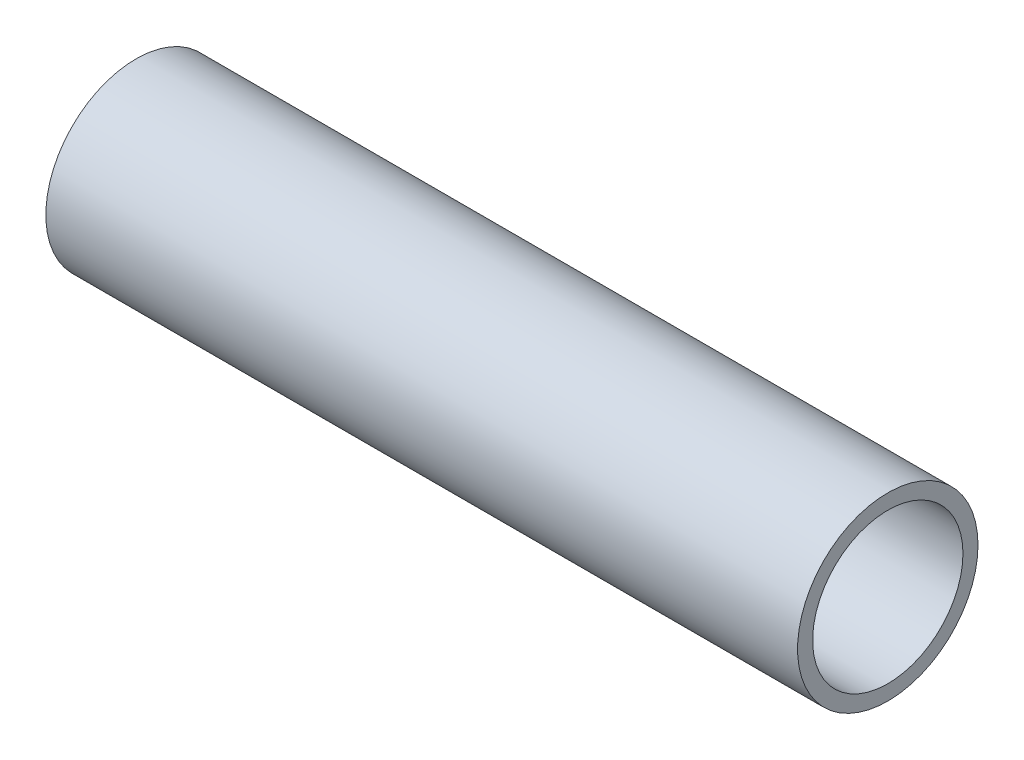
ISO-10303-21;
HEADER;
FILE_DESCRIPTION(('STEP AP214'),'2;1');
FILE_NAME('part.step','',(''),(''),'','','');
FILE_SCHEMA(('AUTOMOTIVE_DESIGN { 1 0 10303 214 1 1 1 1 }'));
ENDSEC;
DATA;
#1=APPLICATION_CONTEXT('core data for automotive mechanical design processes');
#2=APPLICATION_PROTOCOL_DEFINITION('international standard','automotive_design',2000,#1);
#3=PRODUCT_CONTEXT('',#1,'mechanical');
#4=PRODUCT('Part','Part','',(#3));
#5=PRODUCT_RELATED_PRODUCT_CATEGORY('part','',(#4));
#6=PRODUCT_DEFINITION_FORMATION('','',#4);
#7=PRODUCT_DEFINITION_CONTEXT('part definition',#1,'design');
#8=PRODUCT_DEFINITION('design','',#6,#7);
#9=PRODUCT_DEFINITION_SHAPE('','',#8);
#10=(LENGTH_UNIT() NAMED_UNIT(*) SI_UNIT(.MILLI.,.METRE.));
#11=(NAMED_UNIT(*) PLANE_ANGLE_UNIT() SI_UNIT($,.RADIAN.));
#12=(NAMED_UNIT(*) SI_UNIT($,.STERADIAN.) SOLID_ANGLE_UNIT());
#13=UNCERTAINTY_MEASURE_WITH_UNIT(LENGTH_MEASURE(1.E-05),#10,'distance_accuracy_value','');
#14=(GEOMETRIC_REPRESENTATION_CONTEXT(3) GLOBAL_UNCERTAINTY_ASSIGNED_CONTEXT((#13)) GLOBAL_UNIT_ASSIGNED_CONTEXT((#10,
#11,#12)) REPRESENTATION_CONTEXT('',''));
#15=CARTESIAN_POINT('',(0.,0.,0.));
#16=DIRECTION('',(0.,0.,1.));
#17=DIRECTION('',(1.,0.,0.));
#18=AXIS2_PLACEMENT_3D('',#15,#16,#17);
#19=CARTESIAN_POINT('',(25.,0.,0.));
#20=DIRECTION('',(1.,0.,0.));
#21=DIRECTION('',(0.,0.,-1.));
#22=AXIS2_PLACEMENT_3D('',#19,#20,#21);
#23=PLANE('',#22);
#24=CARTESIAN_POINT('',(25.,0.,0.));
#25=DIRECTION('',(1.,0.,0.));
#26=DIRECTION('',(0.,0.,-1.));
#27=AXIS2_PLACEMENT_3D('',#24,#25,#26);
#28=CIRCLE('',#27,6.);
#29=CARTESIAN_POINT('',(25.,0.,-6.));
#30=VERTEX_POINT('',#29);
#31=EDGE_CURVE('E10',#30,#30,#28,.T.);
#32=ORIENTED_EDGE('',*,*,#31,.T.);
#33=EDGE_LOOP('',(#32));
#34=FACE_BOUND('',#33,.T.);
#35=CARTESIAN_POINT('',(25.,0.,0.));
#36=DIRECTION('',(1.,0.,0.));
#37=DIRECTION('',(0.,0.,-1.));
#38=AXIS2_PLACEMENT_3D('',#35,#36,#37);
#39=CIRCLE('',#38,5.);
#40=CARTESIAN_POINT('',(25.,0.,-5.));
#41=VERTEX_POINT('',#40);
#42=EDGE_CURVE('E39',#41,#41,#39,.T.);
#43=ORIENTED_EDGE('',*,*,#42,.F.);
#44=EDGE_LOOP('',(#43));
#45=FACE_BOUND('',#44,.T.);
#46=ADVANCED_FACE('F28',(#34,#45),#23,.T.);
#47=CARTESIAN_POINT('',(-25.,0.,0.));
#48=DIRECTION('',(1.,0.,0.));
#49=DIRECTION('',(0.,0.,-1.));
#50=AXIS2_PLACEMENT_3D('',#47,#48,#49);
#51=PLANE('',#50);
#52=CARTESIAN_POINT('',(-25.,0.,0.));
#53=DIRECTION('',(1.,0.,0.));
#54=DIRECTION('',(0.,0.,-1.));
#55=AXIS2_PLACEMENT_3D('',#52,#53,#54);
#56=CIRCLE('',#55,6.);
#57=CARTESIAN_POINT('',(-25.,0.,-6.));
#58=VERTEX_POINT('',#57);
#59=EDGE_CURVE('E32',#58,#58,#56,.T.);
#60=ORIENTED_EDGE('',*,*,#59,.F.);
#61=EDGE_LOOP('',(#60));
#62=FACE_BOUND('',#61,.T.);
#63=CARTESIAN_POINT('',(-25.,0.,0.));
#64=DIRECTION('',(1.,0.,0.));
#65=DIRECTION('',(0.,0.,-1.));
#66=AXIS2_PLACEMENT_3D('',#63,#64,#65);
#67=CIRCLE('',#66,5.);
#68=CARTESIAN_POINT('',(-25.,0.,-5.));
#69=VERTEX_POINT('',#68);
#70=EDGE_CURVE('E41',#69,#69,#67,.T.);
#71=ORIENTED_EDGE('',*,*,#70,.T.);
#72=EDGE_LOOP('',(#71));
#73=FACE_BOUND('',#72,.T.);
#74=ADVANCED_FACE('F51',(#62,#73),#51,.F.);
#75=CARTESIAN_POINT('',(25.,0.,0.));
#76=DIRECTION('',(-1.,0.,0.));
#77=DIRECTION('',(0.,0.,1.));
#78=AXIS2_PLACEMENT_3D('',#75,#76,#77);
#79=CYLINDRICAL_SURFACE('',#78,6.);
#80=ORIENTED_EDGE('',*,*,#31,.F.);
#81=EDGE_LOOP('',(#80));
#82=FACE_BOUND('',#81,.T.);
#83=ORIENTED_EDGE('',*,*,#59,.T.);
#84=EDGE_LOOP('',(#83));
#85=FACE_BOUND('',#84,.T.);
#86=ADVANCED_FACE('F30',(#82,#85),#79,.T.);
#87=CARTESIAN_POINT('',(25.,0.,0.));
#88=DIRECTION('',(-1.,0.,0.));
#89=DIRECTION('',(0.,0.,1.));
#90=AXIS2_PLACEMENT_3D('',#87,#88,#89);
#91=CYLINDRICAL_SURFACE('',#90,5.);
#92=ORIENTED_EDGE('',*,*,#42,.T.);
#93=EDGE_LOOP('',(#92));
#94=FACE_BOUND('',#93,.T.);
#95=ORIENTED_EDGE('',*,*,#70,.F.);
#96=EDGE_LOOP('',(#95));
#97=FACE_BOUND('',#96,.T.);
#98=ADVANCED_FACE('F47',(#94,#97),#91,.F.);
#99=CLOSED_SHELL('',(#46,#74,#86,#98));
#100=MANIFOLD_SOLID_BREP('B2',#99);
#101=ADVANCED_BREP_SHAPE_REPRESENTATION('',(#18,#100),#14);
#102=SHAPE_DEFINITION_REPRESENTATION(#9,#101);
ENDSEC;
END-ISO-10303-21;
